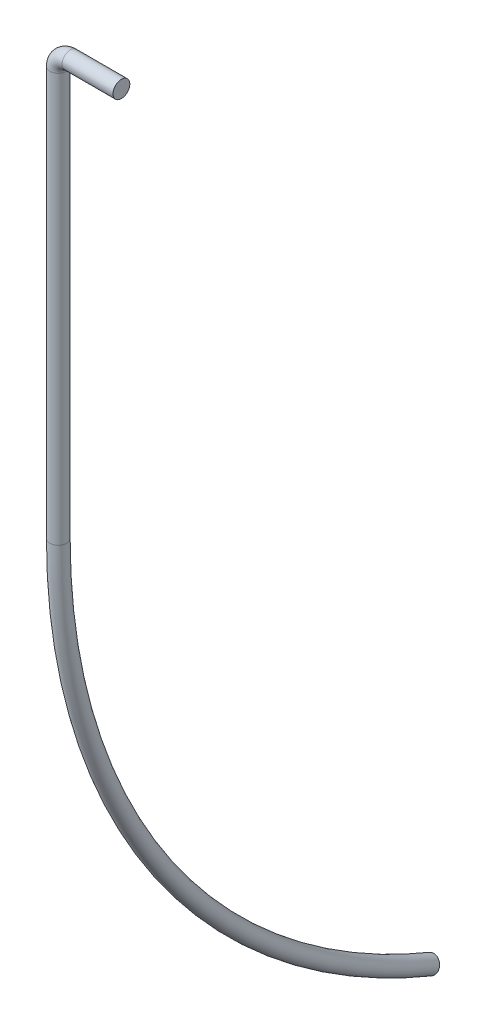
ISO-10303-21;
HEADER;
FILE_DESCRIPTION(('STEP AP214'),'2;1');
FILE_NAME('part.step','',(''),(''),'','','');
FILE_SCHEMA(('AUTOMOTIVE_DESIGN { 1 0 10303 214 1 1 1 1 }'));
ENDSEC;
DATA;
#1=APPLICATION_CONTEXT('core data for automotive mechanical design processes');
#2=APPLICATION_PROTOCOL_DEFINITION('international standard','automotive_design',2000,#1);
#3=PRODUCT_CONTEXT('',#1,'mechanical');
#4=PRODUCT('Part','Part','',(#3));
#5=PRODUCT_RELATED_PRODUCT_CATEGORY('part','',(#4));
#6=PRODUCT_DEFINITION_FORMATION('','',#4);
#7=PRODUCT_DEFINITION_CONTEXT('part definition',#1,'design');
#8=PRODUCT_DEFINITION('design','',#6,#7);
#9=PRODUCT_DEFINITION_SHAPE('','',#8);
#10=(LENGTH_UNIT() NAMED_UNIT(*) SI_UNIT(.MILLI.,.METRE.));
#11=(NAMED_UNIT(*) PLANE_ANGLE_UNIT() SI_UNIT($,.RADIAN.));
#12=(NAMED_UNIT(*) SI_UNIT($,.STERADIAN.) SOLID_ANGLE_UNIT());
#13=UNCERTAINTY_MEASURE_WITH_UNIT(LENGTH_MEASURE(1.E-05),#10,'distance_accuracy_value','');
#14=(GEOMETRIC_REPRESENTATION_CONTEXT(3) GLOBAL_UNCERTAINTY_ASSIGNED_CONTEXT((#13)) GLOBAL_UNIT_ASSIGNED_CONTEXT((#10,
#11,#12)) REPRESENTATION_CONTEXT('',''));
#15=CARTESIAN_POINT('',(0.,0.,0.));
#16=DIRECTION('',(0.,0.,1.));
#17=DIRECTION('',(1.,0.,0.));
#18=AXIS2_PLACEMENT_3D('',#15,#16,#17);
#19=CARTESIAN_POINT('',(-19.337844804891,-48.0060000000001,3.80999999999997));
#20=DIRECTION('',(1.,-2.1614320428113E-13,0.));
#21=DIRECTION('',(2.1614320428113E-13,1.,0.));
#22=AXIS2_PLACEMENT_3D('',#19,#20,#21);
#23=PLANE('',#22);
#24=CARTESIAN_POINT('',(-19.3378448048908,-48.0060000000001,3.80999999999997));
#25=DIRECTION('',(1.,0.,0.));
#26=DIRECTION('',(0.,1.,0.));
#27=AXIS2_PLACEMENT_3D('',#24,#25,#26);
#28=CIRCLE('',#27,1.143);
#29=CARTESIAN_POINT('',(-19.3378448048908,-46.8630000000001,3.80999999999997));
#30=VERTEX_POINT('',#29);
#31=EDGE_CURVE('E16',#30,#30,#28,.F.);
#32=ORIENTED_EDGE('',*,*,#31,.F.);
#33=EDGE_LOOP('',(#32));
#34=FACE_BOUND('',#33,.T.);
#35=ADVANCED_FACE('F13',(#34),#23,.T.);
#36=CARTESIAN_POINT('',(-26.2889999999995,-48.0060000000001,3.80999999999997));
#37=DIRECTION('',(1.,0.,0.));
#38=DIRECTION('',(0.,1.,0.));
#39=AXIS2_PLACEMENT_3D('',#36,#37,#38);
#40=CYLINDRICAL_SURFACE('',#39,1.143);
#41=CARTESIAN_POINT('',(-26.2889999999995,-48.0060000000001,3.80999999999997));
#42=DIRECTION('',(-1.,2.16130857750087E-13,0.));
#43=DIRECTION('',(2.15578969266519E-13,1.,0.));
#44=AXIS2_PLACEMENT_3D('',#41,#42,#43);
#45=CIRCLE('',#44,1.143);
#46=CARTESIAN_POINT('',(-26.2889999999993,-46.8630000000001,3.80999999999997));
#47=VERTEX_POINT('',#46);
#48=EDGE_CURVE('E32',#47,#47,#45,.T.);
#49=ORIENTED_EDGE('',*,*,#48,.F.);
#50=EDGE_LOOP('',(#49));
#51=FACE_BOUND('',#50,.T.);
#52=ORIENTED_EDGE('',*,*,#31,.T.);
#53=EDGE_LOOP('',(#52));
#54=FACE_BOUND('',#53,.T.);
#55=ADVANCED_FACE('F49',(#51,#54),#40,.T.);
#56=CARTESIAN_POINT('',(-26.2889999999999,-49.6570000000001,3.80999999999997));
#57=DIRECTION('',(0.,0.,1.));
#58=DIRECTION('',(0.,-1.,0.));
#59=AXIS2_PLACEMENT_3D('',#56,#57,#58);
#60=TOROIDAL_SURFACE('',#59,1.651,1.143);
#61=ORIENTED_EDGE('',*,*,#48,.T.);
#62=EDGE_LOOP('',(#61));
#63=FACE_BOUND('',#62,.T.);
#64=CARTESIAN_POINT('',(-27.9399999999999,-49.6570000000001,3.80999999999996));
#65=DIRECTION('',(0.,1.,0.));
#66=DIRECTION('',(-1.,0.,0.));
#67=AXIS2_PLACEMENT_3D('',#64,#65,#66);
#68=CIRCLE('',#67,1.143);
#69=CARTESIAN_POINT('',(-29.0829999999999,-49.6570000000001,3.80999999999996));
#70=VERTEX_POINT('',#69);
#71=EDGE_CURVE('E24',#70,#70,#68,.F.);
#72=ORIENTED_EDGE('',*,*,#71,.F.);
#73=EDGE_LOOP('',(#72));
#74=FACE_BOUND('',#73,.T.);
#75=ADVANCED_FACE('F45',(#63,#74),#60,.T.);
#76=CARTESIAN_POINT('',(-27.9399999999995,-202.057,3.80999999999979));
#77=DIRECTION('',(0.,1.,0.));
#78=DIRECTION('',(-1.,0.,0.));
#79=AXIS2_PLACEMENT_3D('',#76,#77,#78);
#80=CYLINDRICAL_SURFACE('',#79,1.143);
#81=CARTESIAN_POINT('',(-27.9399999999998,-105.349649494643,3.8099999999999));
#82=DIRECTION('',(0.,-1.,0.));
#83=DIRECTION('',(0.,0.,1.));
#84=AXIS2_PLACEMENT_3D('',#81,#82,#83);
#85=CIRCLE('',#84,1.143);
#86=CARTESIAN_POINT('',(-27.9399999999998,-105.349649494643,4.9529999999999));
#87=VERTEX_POINT('',#86);
#88=EDGE_CURVE('E20',#87,#87,#85,.T.);
#89=ORIENTED_EDGE('',*,*,#88,.F.);
#90=EDGE_LOOP('',(#89));
#91=FACE_BOUND('',#90,.T.);
#92=ORIENTED_EDGE('',*,*,#71,.T.);
#93=EDGE_LOOP('',(#92));
#94=FACE_BOUND('',#93,.T.);
#95=ADVANCED_FACE('F41',(#91,#94),#80,.T.);
#96=CARTESIAN_POINT('',(-29.0967159999996,-179.872139539518,-47.3597402337819));
#97=DIRECTION('',(0.,-0.378936718018439,-0.925422586571894));
#98=DIRECTION('',(0.,0.925422586571894,-0.378936718018439));
#99=AXIS2_PLACEMENT_3D('',#96,#97,#98);
#100=PLANE('',#99);
#101=CARTESIAN_POINT('',(-27.9399999999995,-179.884832635715,-47.3545427377576));
#102=CARTESIAN_POINT('',(-28.0041714239304,-179.884840021863,-47.3545397133204));
#103=CARTESIAN_POINT('',(-28.0684272959748,-179.889859468644,-47.3524843791226));
#104=CARTESIAN_POINT('',(-28.1634028738578,-179.904803983027,-47.3463649853291));
#105=CARTESIAN_POINT('',(-28.1948665704651,-179.911034288412,-47.3438138357147));
#106=CARTESIAN_POINT('',(-28.2571463227904,-179.925930036104,-47.3377144106253));
#107=CARTESIAN_POINT('',(-28.2879617955713,-179.934597577331,-47.3341652756965));
#108=CARTESIAN_POINT('',(-28.3789486990113,-179.964136680491,-47.322069773634));
#109=CARTESIAN_POINT('',(-28.4378148971462,-179.988569162731,-47.3120653013343));
#110=CARTESIAN_POINT('',(-28.5502735165121,-180.046244532508,-47.2884487226477));
#111=CARTESIAN_POINT('',(-28.6038658169042,-180.079487621856,-47.274836533625));
#112=CARTESIAN_POINT('',(-28.6791359363577,-180.1352084082,-47.2520203065209));
#113=CARTESIAN_POINT('',(-28.7033871677403,-180.154772811147,-47.2440091873304));
#114=CARTESIAN_POINT('',(-28.7500015864602,-180.195700714229,-47.2272502649804));
#115=CARTESIAN_POINT('',(-28.7723665665115,-180.217062466665,-47.2185031774586));
#116=CARTESIAN_POINT('',(-28.8364361989149,-180.283672838696,-47.1912279454408));
#117=CARTESIAN_POINT('',(-28.8751318952156,-180.331458702088,-47.1716608649479));
#118=CARTESIAN_POINT('',(-28.9432820242069,-180.432338188177,-47.1303533132102));
#119=CARTESIAN_POINT('',(-28.9727368053584,-180.485431610634,-47.1086129239585));
#120=CARTESIAN_POINT('',(-29.0216017558351,-180.595447014571,-47.0635644491275));
#121=CARTESIAN_POINT('',(-29.0410120324404,-180.652368955152,-47.0402563802948));
#122=CARTESIAN_POINT('',(-29.0692290726757,-180.76841927577,-46.9927367624922));
#123=CARTESIAN_POINT('',(-29.0780357796782,-180.827547667587,-46.9685252086981));
#124=CARTESIAN_POINT('',(-29.0847982569155,-180.946333491363,-46.919885472796));
#125=CARTESIAN_POINT('',(-29.0827540271504,-181.005990923322,-46.8954572906879));
#126=CARTESIAN_POINT('',(-29.0678701095798,-181.124142641935,-46.8470772045205));
#127=CARTESIAN_POINT('',(-29.0550304794262,-181.1826369348,-46.8231252979183));
#128=CARTESIAN_POINT('',(-29.0189277228501,-181.296794960582,-46.7763805261214));
#129=CARTESIAN_POINT('',(-28.9956644850979,-181.352458663258,-46.7535876733088));
#130=CARTESIAN_POINT('',(-28.9393459745878,-181.45940664905,-46.709795227217));
#131=CARTESIAN_POINT('',(-28.9062903325618,-181.510690766918,-46.688795701602));
#132=CARTESIAN_POINT('',(-28.8501386481217,-181.583162559371,-46.6591203688626));
#133=CARTESIAN_POINT('',(-28.8303229954123,-181.606580839126,-46.6495311863632));
#134=CARTESIAN_POINT('',(-28.7886137822364,-181.651814983009,-46.631008969298));
#135=CARTESIAN_POINT('',(-28.7667182405379,-181.673629283438,-46.6220765750269));
#136=CARTESIAN_POINT('',(-28.6981916175808,-181.736360915985,-46.596389586944));
#137=CARTESIAN_POINT('',(-28.64867058065,-181.774631321927,-46.5807188412376));
#138=CARTESIAN_POINT('',(-28.5433832627465,-181.842922949429,-46.5527551783993));
#139=CARTESIAN_POINT('',(-28.4876171248583,-181.872944359931,-46.5404621839004));
#140=CARTESIAN_POINT('',(-28.4004879293992,-181.911167558117,-46.5248107685548));
#141=CARTESIAN_POINT('',(-28.3708272028529,-181.922783631594,-46.5200542855994));
#142=CARTESIAN_POINT('',(-28.3105835608418,-181.943653038073,-46.5115088010683));
#143=CARTESIAN_POINT('',(-28.2800014634086,-181.952908401691,-46.5077189680078));
#144=CARTESIAN_POINT('',(-28.1872485341087,-181.977005666474,-46.4978517586241));
#145=CARTESIAN_POINT('',(-28.1239183089317,-181.98824560539,-46.4932492930852));
#146=CARTESIAN_POINT('',(-28.0202060593998,-181.998398857782,-46.4890917976941));
#147=CARTESIAN_POINT('',(-27.9801195336671,-182.000353286387,-46.48829150951));
#148=CARTESIAN_POINT('',(-27.8758285760687,-182.000341282471,-46.4882964248046));
#149=CARTESIAN_POINT('',(-27.8115727040243,-181.99532183569,-46.4903517590023));
#150=CARTESIAN_POINT('',(-27.7165971261413,-181.980377321307,-46.4964711527959));
#151=CARTESIAN_POINT('',(-27.685133429534,-181.974147015922,-46.4990223024103));
#152=CARTESIAN_POINT('',(-27.6228536772087,-181.95925126823,-46.5051217274997));
#153=CARTESIAN_POINT('',(-27.5920382044278,-181.950583727003,-46.5086708624285));
#154=CARTESIAN_POINT('',(-27.5010513009878,-181.921044623843,-46.520766364491));
#155=CARTESIAN_POINT('',(-27.4421851028529,-181.896612141603,-46.5307708367907));
#156=CARTESIAN_POINT('',(-27.329726483487,-181.838936771826,-46.5543874154772));
#157=CARTESIAN_POINT('',(-27.2761341830949,-181.805693682478,-46.5679996045));
#158=CARTESIAN_POINT('',(-27.2008640636414,-181.749972896134,-46.5908158316041));
#159=CARTESIAN_POINT('',(-27.1766128322588,-181.730408493187,-46.5988269507946));
#160=CARTESIAN_POINT('',(-27.1299984135389,-181.689480590105,-46.6155858731446));
#161=CARTESIAN_POINT('',(-27.1076334334877,-181.668118837669,-46.6243329606664));
#162=CARTESIAN_POINT('',(-27.0435638010843,-181.601508465638,-46.6516081926841));
#163=CARTESIAN_POINT('',(-27.0048681047835,-181.553722602246,-46.6711752731771));
#164=CARTESIAN_POINT('',(-26.9367179757922,-181.452843116157,-46.7124828249147));
#165=CARTESIAN_POINT('',(-26.9072631946408,-181.3997496937,-46.7342232141665));
#166=CARTESIAN_POINT('',(-26.858398244164,-181.289734289763,-46.7792716889975));
#167=CARTESIAN_POINT('',(-26.8389879675587,-181.232812349182,-46.8025797578301));
#168=CARTESIAN_POINT('',(-26.8107709273234,-181.116762028564,-46.8500993756327));
#169=CARTESIAN_POINT('',(-26.801964220321,-181.057633636747,-46.8743109294269));
#170=CARTESIAN_POINT('',(-26.7952017430837,-180.938847812971,-46.922950665329));
#171=CARTESIAN_POINT('',(-26.7972459728487,-180.879190381012,-46.947378847437));
#172=CARTESIAN_POINT('',(-26.8121298904193,-180.761038662399,-46.9957589336045));
#173=CARTESIAN_POINT('',(-26.824969520573,-180.702544369534,-47.0197108402067));
#174=CARTESIAN_POINT('',(-26.8610722771491,-180.588386343752,-47.0664556120036));
#175=CARTESIAN_POINT('',(-26.8843355149013,-180.532722641076,-47.0892484648161));
#176=CARTESIAN_POINT('',(-26.9406540254114,-180.425774655284,-47.1330409109079));
#177=CARTESIAN_POINT('',(-26.9737096674373,-180.374490537416,-47.154040436523));
#178=CARTESIAN_POINT('',(-27.0298613518775,-180.302018744963,-47.1837157692624));
#179=CARTESIAN_POINT('',(-27.0496770045869,-180.278600465208,-47.1933049517618));
#180=CARTESIAN_POINT('',(-27.0913862177628,-180.233366321325,-47.211827168827));
#181=CARTESIAN_POINT('',(-27.1132817594613,-180.211552020895,-47.2207595630981));
#182=CARTESIAN_POINT('',(-27.1818083824184,-180.148820388349,-47.2464465511811));
#183=CARTESIAN_POINT('',(-27.2313294193491,-180.110549982407,-47.2621172968874));
#184=CARTESIAN_POINT('',(-27.3366167372526,-180.042258354905,-47.2900809597257));
#185=CARTESIAN_POINT('',(-27.3923828751409,-180.012236944403,-47.3023739542246));
#186=CARTESIAN_POINT('',(-27.4795120706,-179.974013746217,-47.3180253695702));
#187=CARTESIAN_POINT('',(-27.5091727971463,-179.96239767274,-47.3227818525256));
#188=CARTESIAN_POINT('',(-27.5694164391574,-179.941528266261,-47.3313273370566));
#189=CARTESIAN_POINT('',(-27.5999985365906,-179.932272902643,-47.3351171701171));
#190=CARTESIAN_POINT('',(-27.6927514658904,-179.90817563786,-47.3449843795009));
#191=CARTESIAN_POINT('',(-27.7560816910674,-179.896935698944,-47.3495868450398));
#192=CARTESIAN_POINT('',(-27.8597939405994,-179.886782446552,-47.3537443404309));
#193=CARTESIAN_POINT('',(-27.8998804663321,-179.884828017947,-47.3545446286149));
#194=CARTESIAN_POINT('',(-27.9399999999995,-179.884832635715,-47.3545427377576));
#195=B_SPLINE_CURVE_WITH_KNOTS('',3,(#101,#102,#103,#104,#105,#106,#107,#108,#109,#110,#111,
#112,#113,#114,#115,#116,#117,#118,#119,#120,#121,#122,#123,#124,#125,#126,#127,#128,#129,#130,
#131,#132,#133,#134,#135,#136,#137,#138,#139,#140,#141,#142,#143,#144,#145,#146,#147,#148,#149,
#150,#151,#152,#153,#154,#155,#156,#157,#158,#159,#160,#161,#162,#163,#164,#165,#166,#167,#168,
#169,#170,#171,#172,#173,#174,#175,#176,#177,#178,#179,#180,#181,#182,#183,#184,#185,#186,#187,
#188,#189,#190,#191,#192,#193,#194),.UNSPECIFIED.,.T.,.F.,(4,2,2,2,2,2,2,2,2,2,2,2,2,2,2,2,2,2,
2,2,2,2,2,2,2,2,2,2,2,2,2,2,2,2,2,2,2,2,2,2,2,2,2,2,2,2,4),(0.,0.192371812316177,
0.288808108162243,0.385327709563632,0.577903399682586,0.770483501193002,0.866900322707985,
0.963224450992889,1.15581063825184,1.34838956250422,1.54096642988134,1.73354432569613,
1.92612222151091,2.118699088888,2.31127801314035,2.50386420039928,2.60018832868417,
2.69660515019915,2.88918525170957,3.0817609418285,3.1782805432299,3.27471683907597,
3.46708865139217,3.58735818770812,3.77973000002431,3.87616629587037,3.97268589727176,
4.1652615873907,4.35784168890112,4.4542585104161,4.55058263870099,4.74316882595996,
4.93574775021235,5.12832461758947,5.32090251340426,5.51348040921902,5.70605727659613,
5.89863620084849,6.0912223881074,6.18754651639229,6.28396333790728,6.4765434394177,
6.66911912953665,6.76563873093804,6.8620750267841,7.05444683910028,7.17471637541616),.UNSPECIFIED.);
#196=CARTESIAN_POINT('',(-27.9399999999995,-179.884832635715,-47.3545427377576));
#197=VERTEX_POINT('',#196);
#198=EDGE_CURVE('E9',#197,#197,#195,.T.);
#199=ORIENTED_EDGE('',*,*,#198,.F.);
#200=EDGE_LOOP('',(#199));
#201=FACE_BOUND('',#200,.T.);
#202=ADVANCED_FACE('F37',(#201),#100,.T.);
#203=CARTESIAN_POINT('',(-27.9399999999998,-105.349649494642,-77.8747808281278));
#204=DIRECTION('',(1.,0.,0.));
#205=DIRECTION('',(0.,-0.926921118847521,0.375256231706363));
#206=AXIS2_PLACEMENT_3D('',#203,#204,#205);
#207=TOROIDAL_SURFACE('',#206,81.6847808281277,1.143);
#208=ORIENTED_EDGE('',*,*,#88,.T.);
#209=EDGE_LOOP('',(#208));
#210=FACE_BOUND('',#209,.T.);
#211=ORIENTED_EDGE('',*,*,#198,.T.);
#212=EDGE_LOOP('',(#211));
#213=FACE_BOUND('',#212,.T.);
#214=ADVANCED_FACE('F34',(#210,#213),#207,.T.);
#215=CLOSED_SHELL('',(#35,#55,#75,#95,#202,#214));
#216=MANIFOLD_SOLID_BREP('B1',#215);
#217=ADVANCED_BREP_SHAPE_REPRESENTATION('',(#18,#216),#14);
#218=SHAPE_DEFINITION_REPRESENTATION(#9,#217);
ENDSEC;
END-ISO-10303-21;
